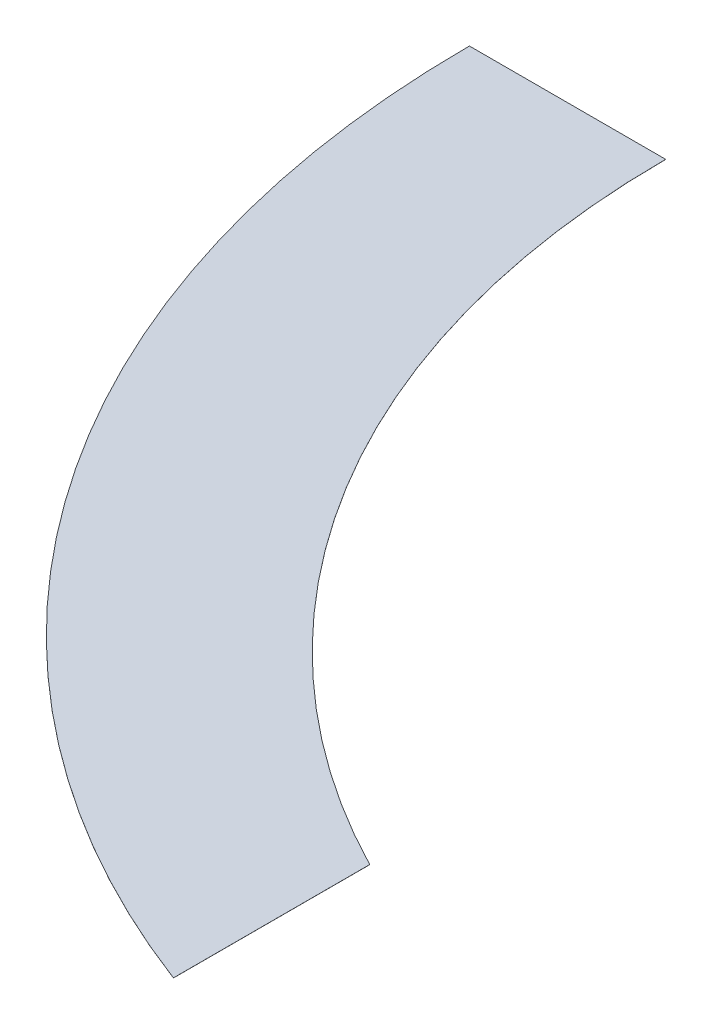
ISO-10303-21;
HEADER;
FILE_DESCRIPTION(('STEP AP214'),'2;1');
FILE_NAME('part.step','',(''),(''),'','','');
FILE_SCHEMA(('AUTOMOTIVE_DESIGN { 1 0 10303 214 1 1 1 1 }'));
ENDSEC;
DATA;
#1=APPLICATION_CONTEXT('core data for automotive mechanical design processes');
#2=APPLICATION_PROTOCOL_DEFINITION('international standard','automotive_design',2000,#1);
#3=PRODUCT_CONTEXT('',#1,'mechanical');
#4=PRODUCT('Part','Part','',(#3));
#5=PRODUCT_RELATED_PRODUCT_CATEGORY('part','',(#4));
#6=PRODUCT_DEFINITION_FORMATION('','',#4);
#7=PRODUCT_DEFINITION_CONTEXT('part definition',#1,'design');
#8=PRODUCT_DEFINITION('design','',#6,#7);
#9=PRODUCT_DEFINITION_SHAPE('','',#8);
#10=(LENGTH_UNIT() NAMED_UNIT(*) SI_UNIT(.MILLI.,.METRE.));
#11=(NAMED_UNIT(*) PLANE_ANGLE_UNIT() SI_UNIT($,.RADIAN.));
#12=(NAMED_UNIT(*) SI_UNIT($,.STERADIAN.) SOLID_ANGLE_UNIT());
#13=UNCERTAINTY_MEASURE_WITH_UNIT(LENGTH_MEASURE(1.E-05),#10,'distance_accuracy_value','');
#14=(GEOMETRIC_REPRESENTATION_CONTEXT(3) GLOBAL_UNCERTAINTY_ASSIGNED_CONTEXT((#13)) GLOBAL_UNIT_ASSIGNED_CONTEXT((#10,
#11,#12)) REPRESENTATION_CONTEXT('',''));
#15=CARTESIAN_POINT('',(0.,0.,0.));
#16=DIRECTION('',(0.,0.,1.));
#17=DIRECTION('',(1.,0.,0.));
#18=AXIS2_PLACEMENT_3D('',#15,#16,#17);
#19=CARTESIAN_POINT('',(-1803.55887707704,0.01,-318.592287302035));
#20=DIRECTION('',(0.,0.,-1.));
#21=DIRECTION('',(-1.,0.,0.));
#22=AXIS2_PLACEMENT_3D('',#19,#20,#21);
#23=PLANE('',#22);
#24=DIRECTION('',(1.,0.,0.));
#25=VECTOR('',#24,1.);
#26=CARTESIAN_POINT('',(-1803.55887707704,0.,-318.592287302035));
#27=LINE('',#26,#25);
#28=CARTESIAN_POINT('',(-1803.55887707704,0.,-318.592287302035));
#29=VERTEX_POINT('',#28);
#30=CARTESIAN_POINT('',(-1783.55887707703,0.,-318.592287302035));
#31=VERTEX_POINT('',#30);
#32=EDGE_CURVE('E110',#29,#31,#27,.T.);
#33=ORIENTED_EDGE('',*,*,#32,.F.);
#34=DIRECTION('',(0.,-1.,0.));
#35=VECTOR('',#34,1.);
#36=CARTESIAN_POINT('',(-1803.55887707704,0.01,-318.592287302035));
#37=LINE('',#36,#35);
#38=CARTESIAN_POINT('',(-1803.55887707704,0.01,-318.592287302035));
#39=VERTEX_POINT('',#38);
#40=EDGE_CURVE('E11',#39,#29,#37,.T.);
#41=ORIENTED_EDGE('',*,*,#40,.F.);
#42=DIRECTION('',(1.,0.,0.));
#43=VECTOR('',#42,1.);
#44=CARTESIAN_POINT('',(-1803.55887707704,0.01,-318.592287302035));
#45=LINE('',#44,#43);
#46=CARTESIAN_POINT('',(-1783.55887707703,0.01,-318.592287302035));
#47=VERTEX_POINT('',#46);
#48=EDGE_CURVE('E102',#39,#47,#45,.T.);
#49=ORIENTED_EDGE('',*,*,#48,.T.);
#50=DIRECTION('',(0.,-1.,0.));
#51=VECTOR('',#50,1.);
#52=CARTESIAN_POINT('',(-1783.55887707703,0.01,-318.592287302035));
#53=LINE('',#52,#51);
#54=EDGE_CURVE('E42',#47,#31,#53,.T.);
#55=ORIENTED_EDGE('',*,*,#54,.T.);
#56=EDGE_LOOP('',(#33,#41,#49,#55));
#57=FACE_BOUND('',#56,.T.);
#58=ADVANCED_FACE('F39',(#57),#23,.T.);
#59=CARTESIAN_POINT('',(-1699.47332899125,0.01,-318.592287302035));
#60=DIRECTION('',(0.,-1.,0.));
#61=DIRECTION('',(0.,0.,-1.));
#62=AXIS2_PLACEMENT_3D('',#59,#60,#61);
#63=CYLINDRICAL_SURFACE('',#62,104.085548085793);
#64=CARTESIAN_POINT('',(-1699.47332899125,0.,-318.592287302035));
#65=DIRECTION('',(0.,1.,0.));
#66=DIRECTION('',(0.,0.,1.));
#67=AXIS2_PLACEMENT_3D('',#64,#65,#66);
#68=CIRCLE('',#67,104.085548085793);
#69=CARTESIAN_POINT('',(-1736.40221480647,0.,-221.27806063005));
#70=VERTEX_POINT('',#69);
#71=EDGE_CURVE('E105',#29,#70,#68,.T.);
#72=ORIENTED_EDGE('',*,*,#71,.T.);
#73=DIRECTION('',(0.,-1.,0.));
#74=VECTOR('',#73,1.);
#75=CARTESIAN_POINT('',(-1736.40221480647,0.01,-221.27806063005));
#76=LINE('',#75,#74);
#77=CARTESIAN_POINT('',(-1736.40221480647,0.01,-221.27806063005));
#78=VERTEX_POINT('',#77);
#79=EDGE_CURVE('E49',#78,#70,#76,.T.);
#80=ORIENTED_EDGE('',*,*,#79,.F.);
#81=CARTESIAN_POINT('',(-1699.47332899125,0.01,-318.592287302035));
#82=DIRECTION('',(0.,1.,0.));
#83=DIRECTION('',(0.,0.,1.));
#84=AXIS2_PLACEMENT_3D('',#81,#82,#83);
#85=CIRCLE('',#84,104.085548085793);
#86=EDGE_CURVE('E97',#39,#78,#85,.T.);
#87=ORIENTED_EDGE('',*,*,#86,.F.);
#88=ORIENTED_EDGE('',*,*,#40,.T.);
#89=EDGE_LOOP('',(#72,#80,#87,#88));
#90=FACE_BOUND('',#89,.T.);
#91=ADVANCED_FACE('F125',(#90),#63,.T.);
#92=CARTESIAN_POINT('',(-1736.40221480647,0.01,-241.278060630055));
#93=DIRECTION('',(1.,0.,0.));
#94=DIRECTION('',(0.,0.,-1.));
#95=AXIS2_PLACEMENT_3D('',#92,#93,#94);
#96=PLANE('',#95);
#97=DIRECTION('',(0.,0.,1.));
#98=VECTOR('',#97,1.);
#99=CARTESIAN_POINT('',(-1736.40221480647,0.,-241.278060630055));
#100=LINE('',#99,#98);
#101=CARTESIAN_POINT('',(-1736.40221480647,0.,-241.278060630055));
#102=VERTEX_POINT('',#101);
#103=EDGE_CURVE('E90',#102,#70,#100,.T.);
#104=ORIENTED_EDGE('',*,*,#103,.F.);
#105=DIRECTION('',(0.,-1.,0.));
#106=VECTOR('',#105,1.);
#107=CARTESIAN_POINT('',(-1736.40221480647,0.01,-241.278060630055));
#108=LINE('',#107,#106);
#109=CARTESIAN_POINT('',(-1736.40221480647,0.01,-241.278060630055));
#110=VERTEX_POINT('',#109);
#111=EDGE_CURVE('E85',#110,#102,#108,.T.);
#112=ORIENTED_EDGE('',*,*,#111,.F.);
#113=DIRECTION('',(0.,0.,1.));
#114=VECTOR('',#113,1.);
#115=CARTESIAN_POINT('',(-1736.40221480647,0.01,-241.278060630055));
#116=LINE('',#115,#114);
#117=EDGE_CURVE('E88',#110,#78,#116,.T.);
#118=ORIENTED_EDGE('',*,*,#117,.T.);
#119=ORIENTED_EDGE('',*,*,#79,.T.);
#120=EDGE_LOOP('',(#104,#112,#118,#119));
#121=FACE_BOUND('',#120,.T.);
#122=ADVANCED_FACE('F87',(#121),#96,.T.);
#123=CARTESIAN_POINT('',(-1696.60148815782,0.01,-318.592287302029));
#124=DIRECTION('',(0.,-1.,0.));
#125=DIRECTION('',(0.,0.,-1.));
#126=AXIS2_PLACEMENT_3D('',#123,#124,#125);
#127=CYLINDRICAL_SURFACE('',#126,86.9573889192121);
#128=CARTESIAN_POINT('',(-1696.60148815782,0.,-318.592287302029));
#129=DIRECTION('',(0.,1.,0.));
#130=DIRECTION('',(0.,0.,1.));
#131=AXIS2_PLACEMENT_3D('',#128,#129,#130);
#132=CIRCLE('',#131,86.9573889192121);
#133=EDGE_CURVE('E114',#31,#102,#132,.T.);
#134=ORIENTED_EDGE('',*,*,#133,.F.);
#135=ORIENTED_EDGE('',*,*,#54,.F.);
#136=CARTESIAN_POINT('',(-1696.60148815782,0.01,-318.592287302029));
#137=DIRECTION('',(0.,1.,0.));
#138=DIRECTION('',(0.,0.,1.));
#139=AXIS2_PLACEMENT_3D('',#136,#137,#138);
#140=CIRCLE('',#139,86.9573889192121);
#141=EDGE_CURVE('E96',#47,#110,#140,.T.);
#142=ORIENTED_EDGE('',*,*,#141,.T.);
#143=ORIENTED_EDGE('',*,*,#111,.T.);
#144=EDGE_LOOP('',(#134,#135,#142,#143));
#145=FACE_BOUND('',#144,.T.);
#146=ADVANCED_FACE('F100',(#145),#127,.F.);
#147=CARTESIAN_POINT('',(-1696.60148815782,0.01,-318.592287302029));
#148=DIRECTION('',(0.,1.,0.));
#149=DIRECTION('',(0.,0.,1.));
#150=AXIS2_PLACEMENT_3D('',#147,#148,#149);
#151=PLANE('',#150);
#152=ORIENTED_EDGE('',*,*,#48,.F.);
#153=ORIENTED_EDGE('',*,*,#86,.T.);
#154=ORIENTED_EDGE('',*,*,#117,.F.);
#155=ORIENTED_EDGE('',*,*,#141,.F.);
#156=EDGE_LOOP('',(#152,#153,#154,#155));
#157=FACE_BOUND('',#156,.T.);
#158=ADVANCED_FACE('F95',(#157),#151,.T.);
#159=CARTESIAN_POINT('',(-1696.60148815782,0.,-318.592287302029));
#160=DIRECTION('',(0.,1.,0.));
#161=DIRECTION('',(0.,0.,1.));
#162=AXIS2_PLACEMENT_3D('',#159,#160,#161);
#163=PLANE('',#162);
#164=ORIENTED_EDGE('',*,*,#32,.T.);
#165=ORIENTED_EDGE('',*,*,#133,.T.);
#166=ORIENTED_EDGE('',*,*,#103,.T.);
#167=ORIENTED_EDGE('',*,*,#71,.F.);
#168=EDGE_LOOP('',(#164,#165,#166,#167));
#169=FACE_BOUND('',#168,.T.);
#170=ADVANCED_FACE('F124',(#169),#163,.F.);
#171=CLOSED_SHELL('',(#58,#91,#122,#146,#158,#170));
#172=MANIFOLD_SOLID_BREP('B2',#171);
#173=ADVANCED_BREP_SHAPE_REPRESENTATION('',(#18,#172),#14);
#174=SHAPE_DEFINITION_REPRESENTATION(#9,#173);
ENDSEC;
END-ISO-10303-21;
